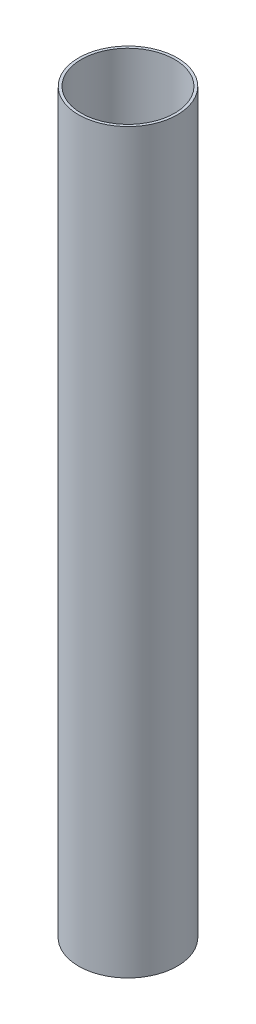
ISO-10303-21;
HEADER;
FILE_DESCRIPTION(('STEP AP214'),'2;1');
FILE_NAME('part.step','',(''),(''),'','','');
FILE_SCHEMA(('AUTOMOTIVE_DESIGN { 1 0 10303 214 1 1 1 1 }'));
ENDSEC;
DATA;
#1=APPLICATION_CONTEXT('core data for automotive mechanical design processes');
#2=APPLICATION_PROTOCOL_DEFINITION('international standard','automotive_design',2000,#1);
#3=PRODUCT_CONTEXT('',#1,'mechanical');
#4=PRODUCT('Part','Part','',(#3));
#5=PRODUCT_RELATED_PRODUCT_CATEGORY('part','',(#4));
#6=PRODUCT_DEFINITION_FORMATION('','',#4);
#7=PRODUCT_DEFINITION_CONTEXT('part definition',#1,'design');
#8=PRODUCT_DEFINITION('design','',#6,#7);
#9=PRODUCT_DEFINITION_SHAPE('','',#8);
#10=(LENGTH_UNIT() NAMED_UNIT(*) SI_UNIT(.MILLI.,.METRE.));
#11=(NAMED_UNIT(*) PLANE_ANGLE_UNIT() SI_UNIT($,.RADIAN.));
#12=(NAMED_UNIT(*) SI_UNIT($,.STERADIAN.) SOLID_ANGLE_UNIT());
#13=UNCERTAINTY_MEASURE_WITH_UNIT(LENGTH_MEASURE(1.E-05),#10,'distance_accuracy_value','');
#14=(GEOMETRIC_REPRESENTATION_CONTEXT(3) GLOBAL_UNCERTAINTY_ASSIGNED_CONTEXT((#13)) GLOBAL_UNIT_ASSIGNED_CONTEXT((#10,
#11,#12)) REPRESENTATION_CONTEXT('',''));
#15=CARTESIAN_POINT('',(0.,0.,0.));
#16=DIRECTION('',(0.,0.,1.));
#17=DIRECTION('',(1.,0.,0.));
#18=AXIS2_PLACEMENT_3D('',#15,#16,#17);
#19=CARTESIAN_POINT('',(0.,431.8,0.));
#20=DIRECTION('',(0.,1.,0.));
#21=DIRECTION('',(0.,0.,1.));
#22=AXIS2_PLACEMENT_3D('',#19,#20,#21);
#23=PLANE('',#22);
#24=CARTESIAN_POINT('',(0.,431.8,0.));
#25=DIRECTION('',(0.,1.,0.));
#26=DIRECTION('',(0.,0.,1.));
#27=AXIS2_PLACEMENT_3D('',#24,#25,#26);
#28=CIRCLE('',#27,28.9052);
#29=CARTESIAN_POINT('',(0.,431.8,28.9052));
#30=VERTEX_POINT('',#29);
#31=EDGE_CURVE('E10',#30,#30,#28,.T.);
#32=ORIENTED_EDGE('',*,*,#31,.T.);
#33=EDGE_LOOP('',(#32));
#34=FACE_BOUND('',#33,.T.);
#35=CARTESIAN_POINT('',(0.,431.8,0.));
#36=DIRECTION('',(0.,1.,0.));
#37=DIRECTION('',(0.,0.,1.));
#38=AXIS2_PLACEMENT_3D('',#35,#36,#37);
#39=CIRCLE('',#38,27.3304);
#40=CARTESIAN_POINT('',(0.,431.8,27.3304));
#41=VERTEX_POINT('',#40);
#42=EDGE_CURVE('E50',#41,#41,#39,.T.);
#43=ORIENTED_EDGE('',*,*,#42,.F.);
#44=EDGE_LOOP('',(#43));
#45=FACE_BOUND('',#44,.T.);
#46=ADVANCED_FACE('F39',(#34,#45),#23,.T.);
#47=CARTESIAN_POINT('',(0.,0.,0.));
#48=DIRECTION('',(0.,1.,0.));
#49=DIRECTION('',(0.,0.,1.));
#50=AXIS2_PLACEMENT_3D('',#47,#48,#49);
#51=PLANE('',#50);
#52=CARTESIAN_POINT('',(0.,0.,0.));
#53=DIRECTION('',(0.,1.,0.));
#54=DIRECTION('',(0.,0.,1.));
#55=AXIS2_PLACEMENT_3D('',#52,#53,#54);
#56=CIRCLE('',#55,28.9052);
#57=CARTESIAN_POINT('',(0.,0.,28.9052));
#58=VERTEX_POINT('',#57);
#59=EDGE_CURVE('E43',#58,#58,#56,.T.);
#60=ORIENTED_EDGE('',*,*,#59,.F.);
#61=EDGE_LOOP('',(#60));
#62=FACE_BOUND('',#61,.T.);
#63=CARTESIAN_POINT('',(0.,0.,0.));
#64=DIRECTION('',(0.,1.,0.));
#65=DIRECTION('',(0.,0.,1.));
#66=AXIS2_PLACEMENT_3D('',#63,#64,#65);
#67=CIRCLE('',#66,27.3304);
#68=CARTESIAN_POINT('',(0.,0.,27.3304));
#69=VERTEX_POINT('',#68);
#70=EDGE_CURVE('E52',#69,#69,#67,.T.);
#71=ORIENTED_EDGE('',*,*,#70,.T.);
#72=EDGE_LOOP('',(#71));
#73=FACE_BOUND('',#72,.T.);
#74=ADVANCED_FACE('F62',(#62,#73),#51,.F.);
#75=CARTESIAN_POINT('',(0.,431.8,0.));
#76=DIRECTION('',(0.,-1.,0.));
#77=DIRECTION('',(0.,0.,-1.));
#78=AXIS2_PLACEMENT_3D('',#75,#76,#77);
#79=CYLINDRICAL_SURFACE('',#78,28.9052);
#80=ORIENTED_EDGE('',*,*,#31,.F.);
#81=EDGE_LOOP('',(#80));
#82=FACE_BOUND('',#81,.T.);
#83=ORIENTED_EDGE('',*,*,#59,.T.);
#84=EDGE_LOOP('',(#83));
#85=FACE_BOUND('',#84,.T.);
#86=ADVANCED_FACE('F41',(#82,#85),#79,.T.);
#87=CARTESIAN_POINT('',(0.,431.8,0.));
#88=DIRECTION('',(0.,-1.,0.));
#89=DIRECTION('',(0.,0.,-1.));
#90=AXIS2_PLACEMENT_3D('',#87,#88,#89);
#91=CYLINDRICAL_SURFACE('',#90,27.3304);
#92=ORIENTED_EDGE('',*,*,#42,.T.);
#93=EDGE_LOOP('',(#92));
#94=FACE_BOUND('',#93,.T.);
#95=ORIENTED_EDGE('',*,*,#70,.F.);
#96=EDGE_LOOP('',(#95));
#97=FACE_BOUND('',#96,.T.);
#98=ADVANCED_FACE('F58',(#94,#97),#91,.F.);
#99=CLOSED_SHELL('',(#46,#74,#86,#98));
#100=MANIFOLD_SOLID_BREP('B2',#99);
#101=ADVANCED_BREP_SHAPE_REPRESENTATION('',(#18,#100),#14);
#102=SHAPE_DEFINITION_REPRESENTATION(#9,#101);
ENDSEC;
END-ISO-10303-21;
